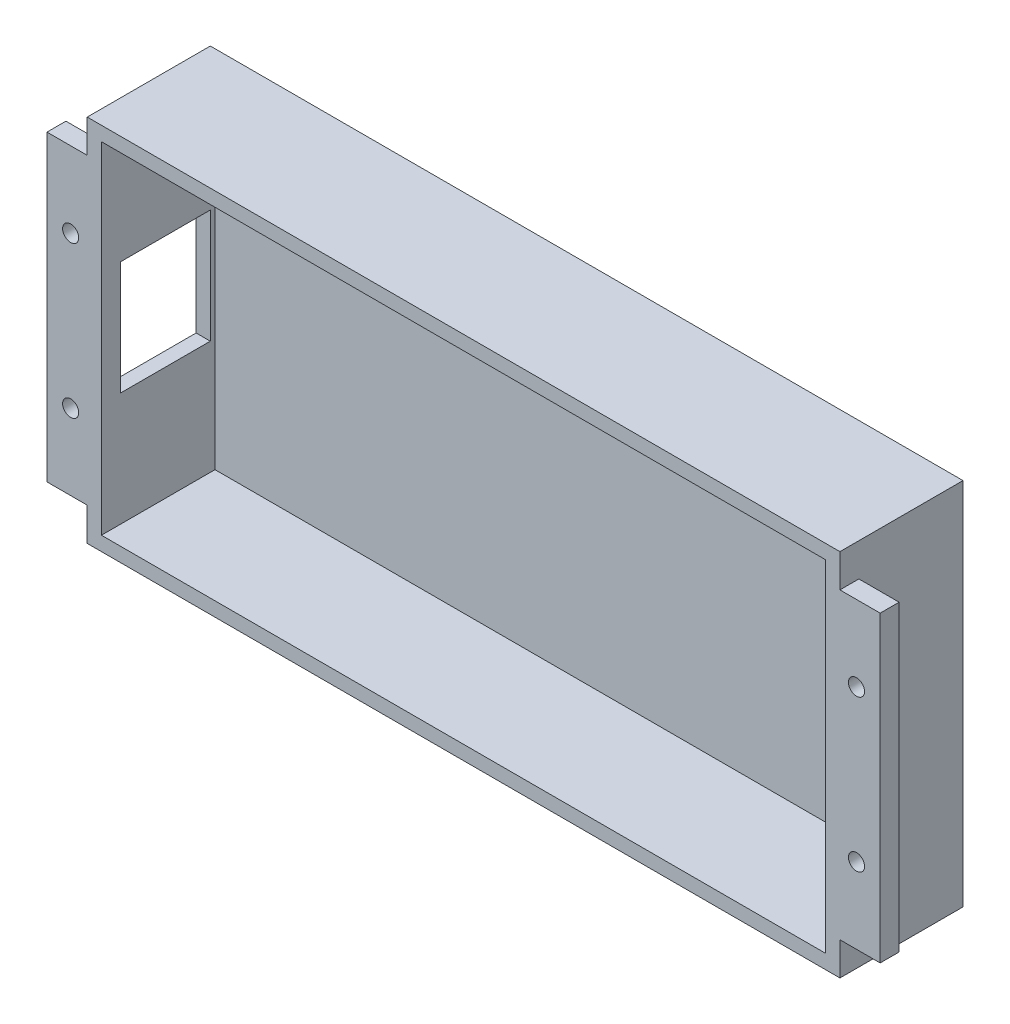
ISO-10303-21;
HEADER;
FILE_DESCRIPTION(('STEP AP214'),'2;1');
FILE_NAME('part.step','',(''),(''),'','','');
FILE_SCHEMA(('AUTOMOTIVE_DESIGN { 1 0 10303 214 1 1 1 1 }'));
ENDSEC;
DATA;
#1=APPLICATION_CONTEXT('core data for automotive mechanical design processes');
#2=APPLICATION_PROTOCOL_DEFINITION('international standard','automotive_design',2000,#1);
#3=PRODUCT_CONTEXT('',#1,'mechanical');
#4=PRODUCT('Part','Part','',(#3));
#5=PRODUCT_RELATED_PRODUCT_CATEGORY('part','',(#4));
#6=PRODUCT_DEFINITION_FORMATION('','',#4);
#7=PRODUCT_DEFINITION_CONTEXT('part definition',#1,'design');
#8=PRODUCT_DEFINITION('design','',#6,#7);
#9=PRODUCT_DEFINITION_SHAPE('','',#8);
#10=(LENGTH_UNIT() NAMED_UNIT(*) SI_UNIT(.MILLI.,.METRE.));
#11=(NAMED_UNIT(*) PLANE_ANGLE_UNIT() SI_UNIT($,.RADIAN.));
#12=(NAMED_UNIT(*) SI_UNIT($,.STERADIAN.) SOLID_ANGLE_UNIT());
#13=UNCERTAINTY_MEASURE_WITH_UNIT(LENGTH_MEASURE(1.E-05),#10,'distance_accuracy_value','');
#14=(GEOMETRIC_REPRESENTATION_CONTEXT(3) GLOBAL_UNCERTAINTY_ASSIGNED_CONTEXT((#13)) GLOBAL_UNIT_ASSIGNED_CONTEXT((#10,
#11,#12)) REPRESENTATION_CONTEXT('',''));
#15=CARTESIAN_POINT('',(0.,0.,0.));
#16=DIRECTION('',(0.,0.,1.));
#17=DIRECTION('',(1.,0.,0.));
#18=AXIS2_PLACEMENT_3D('',#15,#16,#17);
#19=CARTESIAN_POINT('',(-76.5,-36.,43.01));
#20=DIRECTION('',(0.,0.,1.));
#21=DIRECTION('',(1.,0.,0.));
#22=AXIS2_PLACEMENT_3D('',#19,#20,#21);
#23=PLANE('',#22);
#24=DIRECTION('',(0.,1.,0.));
#25=VECTOR('',#24,1.);
#26=CARTESIAN_POINT('',(-76.5,-36.,43.01));
#27=LINE('',#26,#25);
#28=CARTESIAN_POINT('',(-76.5,-36.,43.01));
#29=VERTEX_POINT('',#28);
#30=CARTESIAN_POINT('',(-76.5,36.,43.01));
#31=VERTEX_POINT('',#30);
#32=EDGE_CURVE('E95',#29,#31,#27,.T.);
#33=ORIENTED_EDGE('',*,*,#32,.F.);
#34=DIRECTION('',(1.,0.,0.));
#35=VECTOR('',#34,1.);
#36=CARTESIAN_POINT('',(-76.5,-36.,43.01));
#37=LINE('',#36,#35);
#38=CARTESIAN_POINT('',(76.5,-36.,43.01));
#39=VERTEX_POINT('',#38);
#40=EDGE_CURVE('E92',#29,#39,#37,.T.);
#41=ORIENTED_EDGE('',*,*,#40,.T.);
#42=DIRECTION('',(0.,1.,0.));
#43=VECTOR('',#42,1.);
#44=CARTESIAN_POINT('',(76.5,-36.,43.01));
#45=LINE('',#44,#43);
#46=CARTESIAN_POINT('',(76.5,36.,43.01));
#47=VERTEX_POINT('',#46);
#48=EDGE_CURVE('E125',#39,#47,#45,.T.);
#49=ORIENTED_EDGE('',*,*,#48,.T.);
#50=DIRECTION('',(1.,0.,0.));
#51=VECTOR('',#50,1.);
#52=CARTESIAN_POINT('',(-76.5,36.,43.01));
#53=LINE('',#52,#51);
#54=EDGE_CURVE('E268',#31,#47,#53,.T.);
#55=ORIENTED_EDGE('',*,*,#54,.F.);
#56=EDGE_LOOP('',(#33,#41,#49,#55));
#57=FACE_BOUND('',#56,.T.);
#58=ADVANCED_FACE('F14',(#57),#23,.T.);
#59=CARTESIAN_POINT('',(-88.,-32.,63.));
#60=DIRECTION('',(0.,0.,1.));
#61=DIRECTION('',(1.,0.,0.));
#62=AXIS2_PLACEMENT_3D('',#59,#60,#61);
#63=PLANE('',#62);
#64=CARTESIAN_POINT('',(83.,16.,63.));
#65=DIRECTION('',(0.,0.,1.));
#66=DIRECTION('',(1.,0.,0.));
#67=AXIS2_PLACEMENT_3D('',#64,#65,#66);
#68=CIRCLE('',#67,1.7);
#69=CARTESIAN_POINT('',(84.7,16.,63.));
#70=VERTEX_POINT('',#69);
#71=EDGE_CURVE('E9',#70,#70,#68,.T.);
#72=ORIENTED_EDGE('',*,*,#71,.T.);
#73=EDGE_LOOP('',(#72));
#74=FACE_BOUND('',#73,.T.);
#75=CARTESIAN_POINT('',(83.,-16.,63.));
#76=DIRECTION('',(0.,0.,1.));
#77=DIRECTION('',(1.,0.,0.));
#78=AXIS2_PLACEMENT_3D('',#75,#76,#77);
#79=CIRCLE('',#78,1.7);
#80=CARTESIAN_POINT('',(84.7,-16.,63.));
#81=VERTEX_POINT('',#80);
#82=EDGE_CURVE('E191',#81,#81,#79,.T.);
#83=ORIENTED_EDGE('',*,*,#82,.T.);
#84=EDGE_LOOP('',(#83));
#85=FACE_BOUND('',#84,.T.);
#86=DIRECTION('',(0.,1.,0.));
#87=VECTOR('',#86,1.);
#88=CARTESIAN_POINT('',(88.,-32.,63.));
#89=LINE('',#88,#87);
#90=CARTESIAN_POINT('',(88.,-32.,63.));
#91=VERTEX_POINT('',#90);
#92=CARTESIAN_POINT('',(88.,32.,63.));
#93=VERTEX_POINT('',#92);
#94=EDGE_CURVE('E143',#91,#93,#89,.T.);
#95=ORIENTED_EDGE('',*,*,#94,.F.);
#96=DIRECTION('',(1.,0.,0.));
#97=VECTOR('',#96,1.);
#98=CARTESIAN_POINT('',(-88.,-32.,63.));
#99=LINE('',#98,#97);
#100=CARTESIAN_POINT('',(79.5,-32.,63.));
#101=VERTEX_POINT('',#100);
#102=EDGE_CURVE('E140',#101,#91,#99,.T.);
#103=ORIENTED_EDGE('',*,*,#102,.F.);
#104=DIRECTION('',(0.,-1.,0.));
#105=VECTOR('',#104,1.);
#106=CARTESIAN_POINT('',(79.5,-35.5,63.));
#107=LINE('',#106,#105);
#108=CARTESIAN_POINT('',(79.5,32.,63.));
#109=VERTEX_POINT('',#108);
#110=EDGE_CURVE('E225',#109,#101,#107,.T.);
#111=ORIENTED_EDGE('',*,*,#110,.F.);
#112=DIRECTION('',(1.,0.,0.));
#113=VECTOR('',#112,1.);
#114=CARTESIAN_POINT('',(-88.,32.,63.));
#115=LINE('',#114,#113);
#116=EDGE_CURVE('E352',#109,#93,#115,.T.);
#117=ORIENTED_EDGE('',*,*,#116,.T.);
#118=EDGE_LOOP('',(#95,#103,#111,#117));
#119=FACE_BOUND('',#118,.T.);
#120=ADVANCED_FACE('F577',(#74,#85,#119),#63,.F.);
#121=CARTESIAN_POINT('',(83.,16.,61.99));
#122=DIRECTION('',(0.,0.,1.));
#123=DIRECTION('',(1.,0.,0.));
#124=AXIS2_PLACEMENT_3D('',#121,#122,#123);
#125=CYLINDRICAL_SURFACE('',#124,1.7);
#126=DIRECTION('',(0.,0.,1.));
#127=VECTOR('',#126,1.);
#128=CARTESIAN_POINT('',(84.7,16.,61.99));
#129=LINE('',#128,#127);
#130=CARTESIAN_POINT('',(84.7,16.,67.));
#131=VERTEX_POINT('',#130);
#132=EDGE_CURVE('E25',#70,#131,#129,.T.);
#133=ORIENTED_EDGE('',*,*,#132,.F.);
#134=ORIENTED_EDGE('',*,*,#71,.F.);
#135=ORIENTED_EDGE('',*,*,#132,.T.);
#136=CARTESIAN_POINT('',(83.,16.,67.));
#137=DIRECTION('',(0.,0.,1.));
#138=DIRECTION('',(1.,0.,0.));
#139=AXIS2_PLACEMENT_3D('',#136,#137,#138);
#140=CIRCLE('',#139,1.7);
#141=EDGE_CURVE('E18',#131,#131,#140,.T.);
#142=ORIENTED_EDGE('',*,*,#141,.T.);
#143=EDGE_LOOP('',(#133,#134,#135,#142));
#144=FACE_BOUND('',#143,.T.);
#145=ADVANCED_FACE('F583',(#144),#125,.F.);
#146=CARTESIAN_POINT('',(76.5,-36.,43.01));
#147=DIRECTION('',(1.,0.,0.));
#148=DIRECTION('',(0.,1.,0.));
#149=AXIS2_PLACEMENT_3D('',#146,#147,#148);
#150=PLANE('',#149);
#151=DIRECTION('',(0.,-1.,0.));
#152=VECTOR('',#151,1.);
#153=CARTESIAN_POINT('',(76.5,36.,67.));
#154=LINE('',#153,#152);
#155=CARTESIAN_POINT('',(76.5,36.,67.));
#156=VERTEX_POINT('',#155);
#157=CARTESIAN_POINT('',(76.5,-36.,67.));
#158=VERTEX_POINT('',#157);
#159=EDGE_CURVE('E104',#156,#158,#154,.T.);
#160=ORIENTED_EDGE('',*,*,#159,.F.);
#161=DIRECTION('',(0.,0.,1.));
#162=VECTOR('',#161,1.);
#163=CARTESIAN_POINT('',(76.5,36.,43.01));
#164=LINE('',#163,#162);
#165=EDGE_CURVE('E63',#47,#156,#164,.T.);
#166=ORIENTED_EDGE('',*,*,#165,.F.);
#167=ORIENTED_EDGE('',*,*,#48,.F.);
#168=DIRECTION('',(0.,0.,1.));
#169=VECTOR('',#168,1.);
#170=CARTESIAN_POINT('',(76.5,-36.,43.01));
#171=LINE('',#170,#169);
#172=EDGE_CURVE('E198',#39,#158,#171,.T.);
#173=ORIENTED_EDGE('',*,*,#172,.T.);
#174=EDGE_LOOP('',(#160,#166,#167,#173));
#175=FACE_BOUND('',#174,.T.);
#176=ADVANCED_FACE('F630',(#175),#150,.F.);
#177=CARTESIAN_POINT('',(-76.5,36.,43.01));
#178=DIRECTION('',(0.,1.,0.));
#179=DIRECTION('',(1.,0.,0.));
#180=AXIS2_PLACEMENT_3D('',#177,#178,#179);
#181=PLANE('',#180);
#182=DIRECTION('',(-1.,0.,0.));
#183=VECTOR('',#182,1.);
#184=CARTESIAN_POINT('',(-78.,36.,67.));
#185=LINE('',#184,#183);
#186=CARTESIAN_POINT('',(-76.5,36.,67.));
#187=VERTEX_POINT('',#186);
#188=EDGE_CURVE('E109',#156,#187,#185,.T.);
#189=ORIENTED_EDGE('',*,*,#188,.T.);
#190=DIRECTION('',(0.,0.,1.));
#191=VECTOR('',#190,1.);
#192=CARTESIAN_POINT('',(-76.5,36.,43.01));
#193=LINE('',#192,#191);
#194=EDGE_CURVE('E76',#31,#187,#193,.T.);
#195=ORIENTED_EDGE('',*,*,#194,.F.);
#196=ORIENTED_EDGE('',*,*,#54,.T.);
#197=ORIENTED_EDGE('',*,*,#165,.T.);
#198=EDGE_LOOP('',(#189,#195,#196,#197));
#199=FACE_BOUND('',#198,.T.);
#200=ADVANCED_FACE('F610',(#199),#181,.F.);
#201=CARTESIAN_POINT('',(-76.5,-36.,43.01));
#202=DIRECTION('',(0.,1.,0.));
#203=DIRECTION('',(1.,0.,0.));
#204=AXIS2_PLACEMENT_3D('',#201,#202,#203);
#205=PLANE('',#204);
#206=ORIENTED_EDGE('',*,*,#172,.F.);
#207=ORIENTED_EDGE('',*,*,#40,.F.);
#208=DIRECTION('',(0.,0.,1.));
#209=VECTOR('',#208,1.);
#210=CARTESIAN_POINT('',(-76.5,-36.,43.01));
#211=LINE('',#210,#209);
#212=CARTESIAN_POINT('',(-76.5,-36.,67.));
#213=VERTEX_POINT('',#212);
#214=EDGE_CURVE('E84',#29,#213,#211,.T.);
#215=ORIENTED_EDGE('',*,*,#214,.T.);
#216=DIRECTION('',(-1.,0.,0.));
#217=VECTOR('',#216,1.);
#218=CARTESIAN_POINT('',(-78.,-36.,67.));
#219=LINE('',#218,#217);
#220=EDGE_CURVE('E88',#158,#213,#219,.T.);
#221=ORIENTED_EDGE('',*,*,#220,.F.);
#222=EDGE_LOOP('',(#206,#207,#215,#221));
#223=FACE_BOUND('',#222,.T.);
#224=ADVANCED_FACE('F87',(#223),#205,.T.);
#225=CARTESIAN_POINT('',(-76.5,-36.,43.01));
#226=DIRECTION('',(1.,0.,0.));
#227=DIRECTION('',(0.,1.,0.));
#228=AXIS2_PLACEMENT_3D('',#225,#226,#227);
#229=PLANE('',#228);
#230=DIRECTION('',(0.,-1.,0.));
#231=VECTOR('',#230,1.);
#232=CARTESIAN_POINT('',(-76.5,-24.,44.));
#233=LINE('',#232,#231);
#234=CARTESIAN_POINT('',(-76.5,12.,44.));
#235=VERTEX_POINT('',#234);
#236=CARTESIAN_POINT('',(-76.5,-12.,44.));
#237=VERTEX_POINT('',#236);
#238=EDGE_CURVE('E132',#235,#237,#233,.T.);
#239=ORIENTED_EDGE('',*,*,#238,.T.);
#240=DIRECTION('',(0.,0.,1.));
#241=VECTOR('',#240,1.);
#242=CARTESIAN_POINT('',(-76.5,-12.,43.505));
#243=LINE('',#242,#241);
#244=CARTESIAN_POINT('',(-76.5,-12.,63.));
#245=VERTEX_POINT('',#244);
#246=EDGE_CURVE('E133',#237,#245,#243,.T.);
#247=ORIENTED_EDGE('',*,*,#246,.T.);
#248=DIRECTION('',(0.,-1.,0.));
#249=VECTOR('',#248,1.);
#250=CARTESIAN_POINT('',(-76.5,-24.,63.));
#251=LINE('',#250,#249);
#252=CARTESIAN_POINT('',(-76.5,12.,63.));
#253=VERTEX_POINT('',#252);
#254=EDGE_CURVE('E224',#253,#245,#251,.T.);
#255=ORIENTED_EDGE('',*,*,#254,.F.);
#256=DIRECTION('',(0.,0.,1.));
#257=VECTOR('',#256,1.);
#258=CARTESIAN_POINT('',(-76.5,12.,43.505));
#259=LINE('',#258,#257);
#260=EDGE_CURVE('E197',#235,#253,#259,.T.);
#261=ORIENTED_EDGE('',*,*,#260,.F.);
#262=EDGE_LOOP('',(#239,#247,#255,#261));
#263=FACE_BOUND('',#262,.T.);
#264=ORIENTED_EDGE('',*,*,#214,.F.);
#265=ORIENTED_EDGE('',*,*,#32,.T.);
#266=ORIENTED_EDGE('',*,*,#194,.T.);
#267=DIRECTION('',(0.,1.,0.));
#268=VECTOR('',#267,1.);
#269=CARTESIAN_POINT('',(-76.5,-36.,67.));
#270=LINE('',#269,#268);
#271=EDGE_CURVE('E103',#213,#187,#270,.T.);
#272=ORIENTED_EDGE('',*,*,#271,.F.);
#273=EDGE_LOOP('',(#264,#265,#266,#272));
#274=FACE_BOUND('',#273,.T.);
#275=ADVANCED_FACE('F107',(#263,#274),#229,.T.);
#276=CARTESIAN_POINT('',(-83.,16.,61.99));
#277=DIRECTION('',(0.,0.,1.));
#278=DIRECTION('',(1.,0.,0.));
#279=AXIS2_PLACEMENT_3D('',#276,#277,#278);
#280=CYLINDRICAL_SURFACE('',#279,1.7);
#281=DIRECTION('',(0.,0.,1.));
#282=VECTOR('',#281,1.);
#283=CARTESIAN_POINT('',(-81.3,16.,61.99));
#284=LINE('',#283,#282);
#285=CARTESIAN_POINT('',(-81.3,16.,63.));
#286=VERTEX_POINT('',#285);
#287=CARTESIAN_POINT('',(-81.3,16.,67.));
#288=VERTEX_POINT('',#287);
#289=EDGE_CURVE('E96',#286,#288,#284,.T.);
#290=ORIENTED_EDGE('',*,*,#289,.F.);
#291=CARTESIAN_POINT('',(-83.,16.,63.));
#292=DIRECTION('',(0.,0.,1.));
#293=DIRECTION('',(1.,0.,0.));
#294=AXIS2_PLACEMENT_3D('',#291,#292,#293);
#295=CIRCLE('',#294,1.7);
#296=EDGE_CURVE('E215',#286,#286,#295,.T.);
#297=ORIENTED_EDGE('',*,*,#296,.F.);
#298=ORIENTED_EDGE('',*,*,#289,.T.);
#299=CARTESIAN_POINT('',(-83.,16.,67.));
#300=DIRECTION('',(0.,0.,1.));
#301=DIRECTION('',(1.,0.,0.));
#302=AXIS2_PLACEMENT_3D('',#299,#300,#301);
#303=CIRCLE('',#302,1.7);
#304=EDGE_CURVE('E110',#288,#288,#303,.T.);
#305=ORIENTED_EDGE('',*,*,#304,.T.);
#306=EDGE_LOOP('',(#290,#297,#298,#305));
#307=FACE_BOUND('',#306,.T.);
#308=ADVANCED_FACE('F597',(#307),#280,.F.);
#309=CARTESIAN_POINT('',(83.,-16.,61.99));
#310=DIRECTION('',(0.,0.,1.));
#311=DIRECTION('',(1.,0.,0.));
#312=AXIS2_PLACEMENT_3D('',#309,#310,#311);
#313=CYLINDRICAL_SURFACE('',#312,1.7);
#314=DIRECTION('',(0.,0.,1.));
#315=VECTOR('',#314,1.);
#316=CARTESIAN_POINT('',(84.7,-16.,61.99));
#317=LINE('',#316,#315);
#318=CARTESIAN_POINT('',(84.7,-16.,67.));
#319=VERTEX_POINT('',#318);
#320=EDGE_CURVE('E219',#81,#319,#317,.T.);
#321=ORIENTED_EDGE('',*,*,#320,.F.);
#322=ORIENTED_EDGE('',*,*,#82,.F.);
#323=ORIENTED_EDGE('',*,*,#320,.T.);
#324=CARTESIAN_POINT('',(83.,-16.,67.));
#325=DIRECTION('',(0.,0.,1.));
#326=DIRECTION('',(1.,0.,0.));
#327=AXIS2_PLACEMENT_3D('',#324,#325,#326);
#328=CIRCLE('',#327,1.7);
#329=EDGE_CURVE('E119',#319,#319,#328,.T.);
#330=ORIENTED_EDGE('',*,*,#329,.T.);
#331=EDGE_LOOP('',(#321,#322,#323,#330));
#332=FACE_BOUND('',#331,.T.);
#333=ADVANCED_FACE('F598',(#332),#313,.F.);
#334=CARTESIAN_POINT('',(-83.,-16.,61.99));
#335=DIRECTION('',(0.,0.,1.));
#336=DIRECTION('',(1.,0.,0.));
#337=AXIS2_PLACEMENT_3D('',#334,#335,#336);
#338=CYLINDRICAL_SURFACE('',#337,1.7);
#339=DIRECTION('',(0.,0.,1.));
#340=VECTOR('',#339,1.);
#341=CARTESIAN_POINT('',(-81.3,-16.,61.99));
#342=LINE('',#341,#340);
#343=CARTESIAN_POINT('',(-81.3,-16.,63.));
#344=VERTEX_POINT('',#343);
#345=CARTESIAN_POINT('',(-81.3,-16.,67.));
#346=VERTEX_POINT('',#345);
#347=EDGE_CURVE('E240',#344,#346,#342,.T.);
#348=ORIENTED_EDGE('',*,*,#347,.F.);
#349=CARTESIAN_POINT('',(-83.,-16.,63.));
#350=DIRECTION('',(0.,0.,1.));
#351=DIRECTION('',(1.,0.,0.));
#352=AXIS2_PLACEMENT_3D('',#349,#350,#351);
#353=CIRCLE('',#352,1.7);
#354=EDGE_CURVE('E244',#344,#344,#353,.T.);
#355=ORIENTED_EDGE('',*,*,#354,.F.);
#356=ORIENTED_EDGE('',*,*,#347,.T.);
#357=CARTESIAN_POINT('',(-83.,-16.,67.));
#358=DIRECTION('',(0.,0.,1.));
#359=DIRECTION('',(1.,0.,0.));
#360=AXIS2_PLACEMENT_3D('',#357,#358,#359);
#361=CIRCLE('',#360,1.7);
#362=EDGE_CURVE('E146',#346,#346,#361,.T.);
#363=ORIENTED_EDGE('',*,*,#362,.T.);
#364=EDGE_LOOP('',(#348,#355,#356,#363));
#365=FACE_BOUND('',#364,.T.);
#366=ADVANCED_FACE('F593',(#365),#338,.F.);
#367=CARTESIAN_POINT('',(-88.,32.,63.));
#368=DIRECTION('',(0.,1.,0.));
#369=DIRECTION('',(1.,0.,0.));
#370=AXIS2_PLACEMENT_3D('',#367,#368,#369);
#371=PLANE('',#370);
#372=ORIENTED_EDGE('',*,*,#116,.F.);
#373=DIRECTION('',(0.,0.,1.));
#374=VECTOR('',#373,1.);
#375=CARTESIAN_POINT('',(79.5,32.,52.));
#376=LINE('',#375,#374);
#377=CARTESIAN_POINT('',(79.5,32.,67.));
#378=VERTEX_POINT('',#377);
#379=EDGE_CURVE('E230',#109,#378,#376,.T.);
#380=ORIENTED_EDGE('',*,*,#379,.T.);
#381=DIRECTION('',(1.,0.,0.));
#382=VECTOR('',#381,1.);
#383=CARTESIAN_POINT('',(-88.,32.,67.));
#384=LINE('',#383,#382);
#385=CARTESIAN_POINT('',(88.,32.,67.));
#386=VERTEX_POINT('',#385);
#387=EDGE_CURVE('E167',#378,#386,#384,.T.);
#388=ORIENTED_EDGE('',*,*,#387,.T.);
#389=DIRECTION('',(0.,0.,1.));
#390=VECTOR('',#389,1.);
#391=CARTESIAN_POINT('',(88.,32.,63.));
#392=LINE('',#391,#390);
#393=EDGE_CURVE('E355',#93,#386,#392,.T.);
#394=ORIENTED_EDGE('',*,*,#393,.F.);
#395=EDGE_LOOP('',(#372,#380,#388,#394));
#396=FACE_BOUND('',#395,.T.);
#397=ADVANCED_FACE('F589',(#396),#371,.T.);
#398=CARTESIAN_POINT('',(88.,-32.,63.));
#399=DIRECTION('',(1.,0.,0.));
#400=DIRECTION('',(0.,1.,0.));
#401=AXIS2_PLACEMENT_3D('',#398,#399,#400);
#402=PLANE('',#401);
#403=DIRECTION('',(0.,0.,1.));
#404=VECTOR('',#403,1.);
#405=CARTESIAN_POINT('',(88.,-32.,63.));
#406=LINE('',#405,#404);
#407=CARTESIAN_POINT('',(88.,-32.,67.));
#408=VERTEX_POINT('',#407);
#409=EDGE_CURVE('E144',#91,#408,#406,.T.);
#410=ORIENTED_EDGE('',*,*,#409,.F.);
#411=ORIENTED_EDGE('',*,*,#94,.T.);
#412=ORIENTED_EDGE('',*,*,#393,.T.);
#413=DIRECTION('',(0.,1.,0.));
#414=VECTOR('',#413,1.);
#415=CARTESIAN_POINT('',(88.,-32.,67.));
#416=LINE('',#415,#414);
#417=EDGE_CURVE('E163',#408,#386,#416,.T.);
#418=ORIENTED_EDGE('',*,*,#417,.F.);
#419=EDGE_LOOP('',(#410,#411,#412,#418));
#420=FACE_BOUND('',#419,.T.);
#421=ADVANCED_FACE('F592',(#420),#402,.T.);
#422=CARTESIAN_POINT('',(-88.,-32.,63.));
#423=DIRECTION('',(0.,1.,0.));
#424=DIRECTION('',(1.,0.,0.));
#425=AXIS2_PLACEMENT_3D('',#422,#423,#424);
#426=PLANE('',#425);
#427=ORIENTED_EDGE('',*,*,#409,.T.);
#428=DIRECTION('',(1.,0.,0.));
#429=VECTOR('',#428,1.);
#430=CARTESIAN_POINT('',(-88.,-32.,67.));
#431=LINE('',#430,#429);
#432=CARTESIAN_POINT('',(79.5,-32.,67.));
#433=VERTEX_POINT('',#432);
#434=EDGE_CURVE('E168',#433,#408,#431,.T.);
#435=ORIENTED_EDGE('',*,*,#434,.F.);
#436=DIRECTION('',(0.,0.,1.));
#437=VECTOR('',#436,1.);
#438=CARTESIAN_POINT('',(79.5,-32.,52.));
#439=LINE('',#438,#437);
#440=EDGE_CURVE('E229',#101,#433,#439,.T.);
#441=ORIENTED_EDGE('',*,*,#440,.F.);
#442=ORIENTED_EDGE('',*,*,#102,.T.);
#443=EDGE_LOOP('',(#427,#435,#441,#442));
#444=FACE_BOUND('',#443,.T.);
#445=ADVANCED_FACE('F411',(#444),#426,.F.);
#446=CARTESIAN_POINT('',(-88.,-32.,63.));
#447=DIRECTION('',(1.,0.,0.));
#448=DIRECTION('',(0.,1.,0.));
#449=AXIS2_PLACEMENT_3D('',#446,#447,#448);
#450=PLANE('',#449);
#451=DIRECTION('',(0.,1.,0.));
#452=VECTOR('',#451,1.);
#453=CARTESIAN_POINT('',(-88.,-32.,67.));
#454=LINE('',#453,#452);
#455=CARTESIAN_POINT('',(-88.,-32.,67.));
#456=VERTEX_POINT('',#455);
#457=CARTESIAN_POINT('',(-88.,32.,67.));
#458=VERTEX_POINT('',#457);
#459=EDGE_CURVE('E184',#456,#458,#454,.T.);
#460=ORIENTED_EDGE('',*,*,#459,.T.);
#461=DIRECTION('',(0.,0.,1.));
#462=VECTOR('',#461,1.);
#463=CARTESIAN_POINT('',(-88.,32.,63.));
#464=LINE('',#463,#462);
#465=CARTESIAN_POINT('',(-88.,32.,63.));
#466=VERTEX_POINT('',#465);
#467=EDGE_CURVE('E174',#466,#458,#464,.T.);
#468=ORIENTED_EDGE('',*,*,#467,.F.);
#469=DIRECTION('',(0.,1.,0.));
#470=VECTOR('',#469,1.);
#471=CARTESIAN_POINT('',(-88.,-32.,63.));
#472=LINE('',#471,#470);
#473=CARTESIAN_POINT('',(-88.,-32.,63.));
#474=VERTEX_POINT('',#473);
#475=EDGE_CURVE('E157',#474,#466,#472,.T.);
#476=ORIENTED_EDGE('',*,*,#475,.F.);
#477=DIRECTION('',(0.,0.,1.));
#478=VECTOR('',#477,1.);
#479=CARTESIAN_POINT('',(-88.,-32.,63.));
#480=LINE('',#479,#478);
#481=EDGE_CURVE('E153',#474,#456,#480,.T.);
#482=ORIENTED_EDGE('',*,*,#481,.T.);
#483=EDGE_LOOP('',(#460,#468,#476,#482));
#484=FACE_BOUND('',#483,.T.);
#485=ADVANCED_FACE('F16',(#484),#450,.F.);
#486=CARTESIAN_POINT('',(79.5,-39.,41.));
#487=DIRECTION('',(1.,0.,0.));
#488=DIRECTION('',(0.,1.,0.));
#489=AXIS2_PLACEMENT_3D('',#486,#487,#488);
#490=PLANE('',#489);
#491=DIRECTION('',(0.,1.,0.));
#492=VECTOR('',#491,1.);
#493=CARTESIAN_POINT('',(79.5,-39.,67.));
#494=LINE('',#493,#492);
#495=CARTESIAN_POINT('',(79.5,-39.,67.));
#496=VERTEX_POINT('',#495);
#497=EDGE_CURVE('E252',#496,#433,#494,.T.);
#498=ORIENTED_EDGE('',*,*,#497,.F.);
#499=DIRECTION('',(0.,0.,1.));
#500=VECTOR('',#499,1.);
#501=CARTESIAN_POINT('',(79.5,-39.,41.));
#502=LINE('',#501,#500);
#503=CARTESIAN_POINT('',(79.5,-39.,41.));
#504=VERTEX_POINT('',#503);
#505=EDGE_CURVE('E235',#504,#496,#502,.T.);
#506=ORIENTED_EDGE('',*,*,#505,.F.);
#507=DIRECTION('',(0.,1.,0.));
#508=VECTOR('',#507,1.);
#509=CARTESIAN_POINT('',(79.5,-39.,41.));
#510=LINE('',#509,#508);
#511=CARTESIAN_POINT('',(79.5,39.,41.));
#512=VERTEX_POINT('',#511);
#513=EDGE_CURVE('E236',#504,#512,#510,.T.);
#514=ORIENTED_EDGE('',*,*,#513,.T.);
#515=DIRECTION('',(0.,0.,1.));
#516=VECTOR('',#515,1.);
#517=CARTESIAN_POINT('',(79.5,39.,41.));
#518=LINE('',#517,#516);
#519=CARTESIAN_POINT('',(79.5,39.,67.));
#520=VERTEX_POINT('',#519);
#521=EDGE_CURVE('E173',#512,#520,#518,.T.);
#522=ORIENTED_EDGE('',*,*,#521,.T.);
#523=DIRECTION('',(0.,1.,0.));
#524=VECTOR('',#523,1.);
#525=CARTESIAN_POINT('',(79.5,-39.,67.));
#526=LINE('',#525,#524);
#527=EDGE_CURVE('E182',#378,#520,#526,.T.);
#528=ORIENTED_EDGE('',*,*,#527,.F.);
#529=ORIENTED_EDGE('',*,*,#379,.F.);
#530=ORIENTED_EDGE('',*,*,#110,.T.);
#531=ORIENTED_EDGE('',*,*,#440,.T.);
#532=EDGE_LOOP('',(#498,#506,#514,#522,#528,#529,#530,#531));
#533=FACE_BOUND('',#532,.T.);
#534=ADVANCED_FACE('F523',(#533),#490,.T.);
#535=CARTESIAN_POINT('',(-79.5,-39.,41.));
#536=DIRECTION('',(0.,1.,0.));
#537=DIRECTION('',(1.,0.,0.));
#538=AXIS2_PLACEMENT_3D('',#535,#536,#537);
#539=PLANE('',#538);
#540=ORIENTED_EDGE('',*,*,#505,.T.);
#541=DIRECTION('',(1.,0.,0.));
#542=VECTOR('',#541,1.);
#543=CARTESIAN_POINT('',(-79.5,-39.,67.));
#544=LINE('',#543,#542);
#545=CARTESIAN_POINT('',(-79.5,-39.,67.));
#546=VERTEX_POINT('',#545);
#547=EDGE_CURVE('E248',#546,#496,#544,.T.);
#548=ORIENTED_EDGE('',*,*,#547,.F.);
#549=DIRECTION('',(0.,0.,1.));
#550=VECTOR('',#549,1.);
#551=CARTESIAN_POINT('',(-79.5,-39.,41.));
#552=LINE('',#551,#550);
#553=CARTESIAN_POINT('',(-79.5,-39.,41.));
#554=VERTEX_POINT('',#553);
#555=EDGE_CURVE('E283',#554,#546,#552,.T.);
#556=ORIENTED_EDGE('',*,*,#555,.F.);
#557=DIRECTION('',(1.,0.,0.));
#558=VECTOR('',#557,1.);
#559=CARTESIAN_POINT('',(-79.5,-39.,41.));
#560=LINE('',#559,#558);
#561=EDGE_CURVE('E231',#554,#504,#560,.T.);
#562=ORIENTED_EDGE('',*,*,#561,.T.);
#563=EDGE_LOOP('',(#540,#548,#556,#562));
#564=FACE_BOUND('',#563,.T.);
#565=ADVANCED_FACE('F587',(#564),#539,.F.);
#566=CARTESIAN_POINT('',(-79.5,-39.,41.));
#567=DIRECTION('',(0.,0.,1.));
#568=DIRECTION('',(1.,0.,0.));
#569=AXIS2_PLACEMENT_3D('',#566,#567,#568);
#570=PLANE('',#569);
#571=DIRECTION('',(1.,0.,0.));
#572=VECTOR('',#571,1.);
#573=CARTESIAN_POINT('',(-79.5,39.,41.));
#574=LINE('',#573,#572);
#575=CARTESIAN_POINT('',(-79.5,39.,41.));
#576=VERTEX_POINT('',#575);
#577=EDGE_CURVE('E169',#576,#512,#574,.T.);
#578=ORIENTED_EDGE('',*,*,#577,.T.);
#579=ORIENTED_EDGE('',*,*,#513,.F.);
#580=ORIENTED_EDGE('',*,*,#561,.F.);
#581=DIRECTION('',(0.,1.,0.));
#582=VECTOR('',#581,1.);
#583=CARTESIAN_POINT('',(-79.5,-39.,41.));
#584=LINE('',#583,#582);
#585=EDGE_CURVE('E279',#554,#576,#584,.T.);
#586=ORIENTED_EDGE('',*,*,#585,.T.);
#587=EDGE_LOOP('',(#578,#579,#580,#586));
#588=FACE_BOUND('',#587,.T.);
#589=ADVANCED_FACE('F529',(#588),#570,.F.);
#590=CARTESIAN_POINT('',(-79.5,39.,41.));
#591=DIRECTION('',(0.,1.,0.));
#592=DIRECTION('',(1.,0.,0.));
#593=AXIS2_PLACEMENT_3D('',#590,#591,#592);
#594=PLANE('',#593);
#595=ORIENTED_EDGE('',*,*,#577,.F.);
#596=DIRECTION('',(0.,0.,1.));
#597=VECTOR('',#596,1.);
#598=CARTESIAN_POINT('',(-79.5,39.,41.));
#599=LINE('',#598,#597);
#600=CARTESIAN_POINT('',(-79.5,39.,67.));
#601=VERTEX_POINT('',#600);
#602=EDGE_CURVE('E284',#576,#601,#599,.T.);
#603=ORIENTED_EDGE('',*,*,#602,.T.);
#604=DIRECTION('',(1.,0.,0.));
#605=VECTOR('',#604,1.);
#606=CARTESIAN_POINT('',(-79.5,39.,67.));
#607=LINE('',#606,#605);
#608=EDGE_CURVE('E275',#601,#520,#607,.T.);
#609=ORIENTED_EDGE('',*,*,#608,.T.);
#610=ORIENTED_EDGE('',*,*,#521,.F.);
#611=EDGE_LOOP('',(#595,#603,#609,#610));
#612=FACE_BOUND('',#611,.T.);
#613=ADVANCED_FACE('F527',(#612),#594,.T.);
#614=CARTESIAN_POINT('',(-88.,32.,63.));
#615=DIRECTION('',(0.,1.,0.));
#616=DIRECTION('',(1.,0.,0.));
#617=AXIS2_PLACEMENT_3D('',#614,#615,#616);
#618=PLANE('',#617);
#619=DIRECTION('',(1.,0.,0.));
#620=VECTOR('',#619,1.);
#621=CARTESIAN_POINT('',(-88.,32.,63.));
#622=LINE('',#621,#620);
#623=CARTESIAN_POINT('',(-79.5,32.,63.));
#624=VERTEX_POINT('',#623);
#625=EDGE_CURVE('E161',#466,#624,#622,.T.);
#626=ORIENTED_EDGE('',*,*,#625,.F.);
#627=ORIENTED_EDGE('',*,*,#467,.T.);
#628=DIRECTION('',(1.,0.,0.));
#629=VECTOR('',#628,1.);
#630=CARTESIAN_POINT('',(-88.,32.,67.));
#631=LINE('',#630,#629);
#632=CARTESIAN_POINT('',(-79.5,32.,67.));
#633=VERTEX_POINT('',#632);
#634=EDGE_CURVE('E188',#458,#633,#631,.T.);
#635=ORIENTED_EDGE('',*,*,#634,.T.);
#636=DIRECTION('',(0.,0.,1.));
#637=VECTOR('',#636,1.);
#638=CARTESIAN_POINT('',(-79.5,32.,52.));
#639=LINE('',#638,#637);
#640=EDGE_CURVE('E261',#624,#633,#639,.T.);
#641=ORIENTED_EDGE('',*,*,#640,.F.);
#642=EDGE_LOOP('',(#626,#627,#635,#641));
#643=FACE_BOUND('',#642,.T.);
#644=ADVANCED_FACE('F564',(#643),#618,.T.);
#645=CARTESIAN_POINT('',(-86.5,12.,44.));
#646=DIRECTION('',(0.,1.,0.));
#647=DIRECTION('',(1.,0.,0.));
#648=AXIS2_PLACEMENT_3D('',#645,#646,#647);
#649=PLANE('',#648);
#650=ORIENTED_EDGE('',*,*,#260,.T.);
#651=DIRECTION('',(1.,0.,0.));
#652=VECTOR('',#651,1.);
#653=CARTESIAN_POINT('',(-86.5,12.,63.));
#654=LINE('',#653,#652);
#655=CARTESIAN_POINT('',(-79.5,12.,63.));
#656=VERTEX_POINT('',#655);
#657=EDGE_CURVE('E220',#656,#253,#654,.T.);
#658=ORIENTED_EDGE('',*,*,#657,.F.);
#659=DIRECTION('',(0.,0.,1.));
#660=VECTOR('',#659,1.);
#661=CARTESIAN_POINT('',(-79.5,12.,42.5));
#662=LINE('',#661,#660);
#663=CARTESIAN_POINT('',(-79.5,12.,44.));
#664=VERTEX_POINT('',#663);
#665=EDGE_CURVE('E138',#664,#656,#662,.T.);
#666=ORIENTED_EDGE('',*,*,#665,.F.);
#667=DIRECTION('',(1.,0.,0.));
#668=VECTOR('',#667,1.);
#669=CARTESIAN_POINT('',(-86.5,12.,44.));
#670=LINE('',#669,#668);
#671=EDGE_CURVE('E128',#664,#235,#670,.T.);
#672=ORIENTED_EDGE('',*,*,#671,.T.);
#673=EDGE_LOOP('',(#650,#658,#666,#672));
#674=FACE_BOUND('',#673,.T.);
#675=ADVANCED_FACE('F566',(#674),#649,.F.);
#676=CARTESIAN_POINT('',(-86.5,-12.,44.));
#677=DIRECTION('',(0.,0.,1.));
#678=DIRECTION('',(1.,0.,0.));
#679=AXIS2_PLACEMENT_3D('',#676,#677,#678);
#680=PLANE('',#679);
#681=ORIENTED_EDGE('',*,*,#671,.F.);
#682=DIRECTION('',(0.,-1.,0.));
#683=VECTOR('',#682,1.);
#684=CARTESIAN_POINT('',(-79.5,-25.5,44.));
#685=LINE('',#684,#683);
#686=CARTESIAN_POINT('',(-79.5,-12.,44.));
#687=VERTEX_POINT('',#686);
#688=EDGE_CURVE('E134',#664,#687,#685,.T.);
#689=ORIENTED_EDGE('',*,*,#688,.T.);
#690=DIRECTION('',(1.,0.,0.));
#691=VECTOR('',#690,1.);
#692=CARTESIAN_POINT('',(-86.5,-12.,44.));
#693=LINE('',#692,#691);
#694=EDGE_CURVE('E211',#687,#237,#693,.T.);
#695=ORIENTED_EDGE('',*,*,#694,.T.);
#696=ORIENTED_EDGE('',*,*,#238,.F.);
#697=EDGE_LOOP('',(#681,#689,#695,#696));
#698=FACE_BOUND('',#697,.T.);
#699=ADVANCED_FACE('F552',(#698),#680,.T.);
#700=CARTESIAN_POINT('',(-86.5,-12.,44.));
#701=DIRECTION('',(0.,1.,0.));
#702=DIRECTION('',(1.,0.,0.));
#703=AXIS2_PLACEMENT_3D('',#700,#701,#702);
#704=PLANE('',#703);
#705=ORIENTED_EDGE('',*,*,#694,.F.);
#706=DIRECTION('',(0.,0.,1.));
#707=VECTOR('',#706,1.);
#708=CARTESIAN_POINT('',(-79.5,-12.,42.5));
#709=LINE('',#708,#707);
#710=CARTESIAN_POINT('',(-79.5,-12.,63.));
#711=VERTEX_POINT('',#710);
#712=EDGE_CURVE('E139',#687,#711,#709,.T.);
#713=ORIENTED_EDGE('',*,*,#712,.T.);
#714=DIRECTION('',(1.,0.,0.));
#715=VECTOR('',#714,1.);
#716=CARTESIAN_POINT('',(-86.5,-12.,63.));
#717=LINE('',#716,#715);
#718=EDGE_CURVE('E162',#711,#245,#717,.T.);
#719=ORIENTED_EDGE('',*,*,#718,.T.);
#720=ORIENTED_EDGE('',*,*,#246,.F.);
#721=EDGE_LOOP('',(#705,#713,#719,#720));
#722=FACE_BOUND('',#721,.T.);
#723=ADVANCED_FACE('F328',(#722),#704,.T.);
#724=CARTESIAN_POINT('',(-88.,-32.,63.));
#725=DIRECTION('',(0.,0.,1.));
#726=DIRECTION('',(1.,0.,0.));
#727=AXIS2_PLACEMENT_3D('',#724,#725,#726);
#728=PLANE('',#727);
#729=ORIENTED_EDGE('',*,*,#296,.T.);
#730=EDGE_LOOP('',(#729));
#731=FACE_BOUND('',#730,.T.);
#732=ORIENTED_EDGE('',*,*,#354,.T.);
#733=EDGE_LOOP('',(#732));
#734=FACE_BOUND('',#733,.T.);
#735=DIRECTION('',(0.,-1.,0.));
#736=VECTOR('',#735,1.);
#737=CARTESIAN_POINT('',(-79.5,-35.5,63.));
#738=LINE('',#737,#736);
#739=EDGE_CURVE('E204',#624,#656,#738,.T.);
#740=ORIENTED_EDGE('',*,*,#739,.T.);
#741=ORIENTED_EDGE('',*,*,#657,.T.);
#742=ORIENTED_EDGE('',*,*,#254,.T.);
#743=ORIENTED_EDGE('',*,*,#718,.F.);
#744=DIRECTION('',(0.,-1.,0.));
#745=VECTOR('',#744,1.);
#746=CARTESIAN_POINT('',(-79.5,-35.5,63.));
#747=LINE('',#746,#745);
#748=CARTESIAN_POINT('',(-79.5,-32.,63.));
#749=VERTEX_POINT('',#748);
#750=EDGE_CURVE('E175',#711,#749,#747,.T.);
#751=ORIENTED_EDGE('',*,*,#750,.T.);
#752=DIRECTION('',(1.,0.,0.));
#753=VECTOR('',#752,1.);
#754=CARTESIAN_POINT('',(-88.,-32.,63.));
#755=LINE('',#754,#753);
#756=EDGE_CURVE('E156',#474,#749,#755,.T.);
#757=ORIENTED_EDGE('',*,*,#756,.F.);
#758=ORIENTED_EDGE('',*,*,#475,.T.);
#759=ORIENTED_EDGE('',*,*,#625,.T.);
#760=EDGE_LOOP('',(#740,#741,#742,#743,#751,#757,#758,#759));
#761=FACE_BOUND('',#760,.T.);
#762=ADVANCED_FACE('F335',(#731,#734,#761),#728,.F.);
#763=CARTESIAN_POINT('',(-88.,-32.,63.));
#764=DIRECTION('',(0.,1.,0.));
#765=DIRECTION('',(1.,0.,0.));
#766=AXIS2_PLACEMENT_3D('',#763,#764,#765);
#767=PLANE('',#766);
#768=DIRECTION('',(0.,0.,1.));
#769=VECTOR('',#768,1.);
#770=CARTESIAN_POINT('',(-79.5,-32.,52.));
#771=LINE('',#770,#769);
#772=CARTESIAN_POINT('',(-79.5,-32.,67.));
#773=VERTEX_POINT('',#772);
#774=EDGE_CURVE('E179',#749,#773,#771,.T.);
#775=ORIENTED_EDGE('',*,*,#774,.T.);
#776=DIRECTION('',(1.,0.,0.));
#777=VECTOR('',#776,1.);
#778=CARTESIAN_POINT('',(-88.,-32.,67.));
#779=LINE('',#778,#777);
#780=EDGE_CURVE('E123',#456,#773,#779,.T.);
#781=ORIENTED_EDGE('',*,*,#780,.F.);
#782=ORIENTED_EDGE('',*,*,#481,.F.);
#783=ORIENTED_EDGE('',*,*,#756,.T.);
#784=EDGE_LOOP('',(#775,#781,#782,#783));
#785=FACE_BOUND('',#784,.T.);
#786=ADVANCED_FACE('F560',(#785),#767,.F.);
#787=CARTESIAN_POINT('',(-79.5,-39.,67.));
#788=DIRECTION('',(0.,0.,1.));
#789=DIRECTION('',(1.,0.,0.));
#790=AXIS2_PLACEMENT_3D('',#787,#788,#789);
#791=PLANE('',#790);
#792=ORIENTED_EDGE('',*,*,#141,.F.);
#793=EDGE_LOOP('',(#792));
#794=FACE_BOUND('',#793,.T.);
#795=ORIENTED_EDGE('',*,*,#271,.T.);
#796=ORIENTED_EDGE('',*,*,#188,.F.);
#797=ORIENTED_EDGE('',*,*,#159,.T.);
#798=ORIENTED_EDGE('',*,*,#220,.T.);
#799=EDGE_LOOP('',(#795,#796,#797,#798));
#800=FACE_BOUND('',#799,.T.);
#801=ORIENTED_EDGE('',*,*,#304,.F.);
#802=EDGE_LOOP('',(#801));
#803=FACE_BOUND('',#802,.T.);
#804=ORIENTED_EDGE('',*,*,#329,.F.);
#805=EDGE_LOOP('',(#804));
#806=FACE_BOUND('',#805,.T.);
#807=ORIENTED_EDGE('',*,*,#362,.F.);
#808=EDGE_LOOP('',(#807));
#809=FACE_BOUND('',#808,.T.);
#810=DIRECTION('',(0.,1.,0.));
#811=VECTOR('',#810,1.);
#812=CARTESIAN_POINT('',(-79.5,-39.,67.));
#813=LINE('',#812,#811);
#814=EDGE_CURVE('E253',#546,#773,#813,.T.);
#815=ORIENTED_EDGE('',*,*,#814,.F.);
#816=ORIENTED_EDGE('',*,*,#547,.T.);
#817=ORIENTED_EDGE('',*,*,#497,.T.);
#818=ORIENTED_EDGE('',*,*,#434,.T.);
#819=ORIENTED_EDGE('',*,*,#417,.T.);
#820=ORIENTED_EDGE('',*,*,#387,.F.);
#821=ORIENTED_EDGE('',*,*,#527,.T.);
#822=ORIENTED_EDGE('',*,*,#608,.F.);
#823=DIRECTION('',(0.,1.,0.));
#824=VECTOR('',#823,1.);
#825=CARTESIAN_POINT('',(-79.5,-39.,67.));
#826=LINE('',#825,#824);
#827=EDGE_CURVE('E296',#633,#601,#826,.T.);
#828=ORIENTED_EDGE('',*,*,#827,.F.);
#829=ORIENTED_EDGE('',*,*,#634,.F.);
#830=ORIENTED_EDGE('',*,*,#459,.F.);
#831=ORIENTED_EDGE('',*,*,#780,.T.);
#832=EDGE_LOOP('',(#815,#816,#817,#818,#819,#820,#821,#822,#828,#829,#830,#831));
#833=FACE_BOUND('',#832,.T.);
#834=ADVANCED_FACE('F100',(#794,#800,#803,#806,#809,#833),#791,.T.);
#835=CARTESIAN_POINT('',(-79.5,-39.,41.));
#836=DIRECTION('',(1.,0.,0.));
#837=DIRECTION('',(0.,1.,0.));
#838=AXIS2_PLACEMENT_3D('',#835,#836,#837);
#839=PLANE('',#838);
#840=ORIENTED_EDGE('',*,*,#774,.F.);
#841=ORIENTED_EDGE('',*,*,#750,.F.);
#842=ORIENTED_EDGE('',*,*,#712,.F.);
#843=ORIENTED_EDGE('',*,*,#688,.F.);
#844=ORIENTED_EDGE('',*,*,#665,.T.);
#845=ORIENTED_EDGE('',*,*,#739,.F.);
#846=ORIENTED_EDGE('',*,*,#640,.T.);
#847=ORIENTED_EDGE('',*,*,#827,.T.);
#848=ORIENTED_EDGE('',*,*,#602,.F.);
#849=ORIENTED_EDGE('',*,*,#585,.F.);
#850=ORIENTED_EDGE('',*,*,#555,.T.);
#851=ORIENTED_EDGE('',*,*,#814,.T.);
#852=EDGE_LOOP('',(#840,#841,#842,#843,#844,#845,#846,#847,#848,#849,#850,#851));
#853=FACE_BOUND('',#852,.T.);
#854=ADVANCED_FACE('F535',(#853),#839,.F.);
#855=CLOSED_SHELL('',(#58,#120,#145,#176,#200,#224,#275,#308,#333,#366,#397,#421,#445,#485,#534,
#565,#589,#613,#644,#675,#699,#723,#762,#786,#834,#854));
#856=MANIFOLD_SOLID_BREP('B1',#855);
#857=ADVANCED_BREP_SHAPE_REPRESENTATION('',(#18,#856),#14);
#858=SHAPE_DEFINITION_REPRESENTATION(#9,#857);
ENDSEC;
END-ISO-10303-21;
